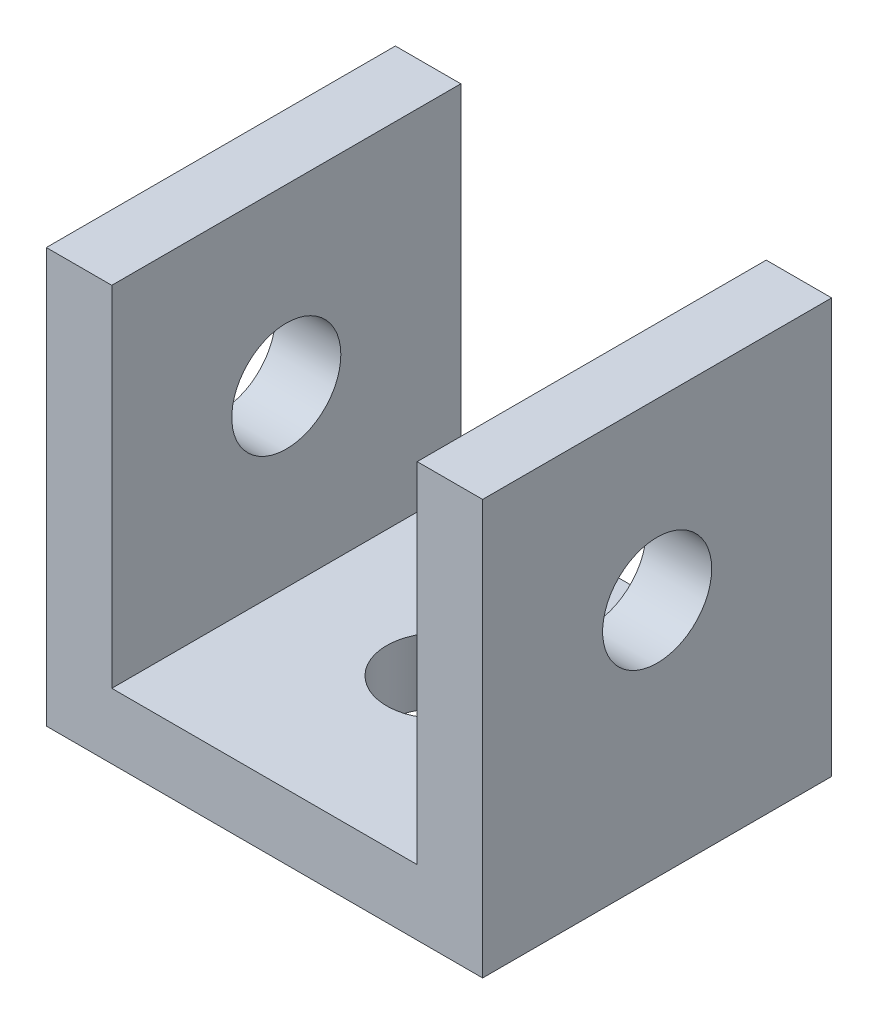
ISO-10303-21;
HEADER;
FILE_DESCRIPTION(('STEP AP214'),'2;1');
FILE_NAME('part.step','',(''),(''),'','','');
FILE_SCHEMA(('AUTOMOTIVE_DESIGN { 1 0 10303 214 1 1 1 1 }'));
ENDSEC;
DATA;
#1=APPLICATION_CONTEXT('core data for automotive mechanical design processes');
#2=APPLICATION_PROTOCOL_DEFINITION('international standard','automotive_design',2000,#1);
#3=PRODUCT_CONTEXT('',#1,'mechanical');
#4=PRODUCT('Part','Part','',(#3));
#5=PRODUCT_RELATED_PRODUCT_CATEGORY('part','',(#4));
#6=PRODUCT_DEFINITION_FORMATION('','',#4);
#7=PRODUCT_DEFINITION_CONTEXT('part definition',#1,'design');
#8=PRODUCT_DEFINITION('design','',#6,#7);
#9=PRODUCT_DEFINITION_SHAPE('','',#8);
#10=(LENGTH_UNIT() NAMED_UNIT(*) SI_UNIT(.MILLI.,.METRE.));
#11=(NAMED_UNIT(*) PLANE_ANGLE_UNIT() SI_UNIT($,.RADIAN.));
#12=(NAMED_UNIT(*) SI_UNIT($,.STERADIAN.) SOLID_ANGLE_UNIT());
#13=UNCERTAINTY_MEASURE_WITH_UNIT(LENGTH_MEASURE(1.E-05),#10,'distance_accuracy_value','');
#14=(GEOMETRIC_REPRESENTATION_CONTEXT(3) GLOBAL_UNCERTAINTY_ASSIGNED_CONTEXT((#13)) GLOBAL_UNIT_ASSIGNED_CONTEXT((#10,
#11,#12)) REPRESENTATION_CONTEXT('',''));
#15=CARTESIAN_POINT('',(0.,0.,0.));
#16=DIRECTION('',(0.,0.,1.));
#17=DIRECTION('',(1.,0.,0.));
#18=AXIS2_PLACEMENT_3D('',#15,#16,#17);
#19=CARTESIAN_POINT('',(0.,1.5,0.));
#20=DIRECTION('',(0.,-1.,0.));
#21=DIRECTION('',(0.,0.,-1.));
#22=AXIS2_PLACEMENT_3D('',#19,#20,#21);
#23=PLANE('',#22);
#24=CARTESIAN_POINT('',(0.,1.5,0.));
#25=DIRECTION('',(0.,-1.,0.));
#26=DIRECTION('',(0.,0.,-1.));
#27=AXIS2_PLACEMENT_3D('',#24,#25,#26);
#28=CIRCLE('',#27,1.2);
#29=CARTESIAN_POINT('',(0.,1.5,-1.2));
#30=VERTEX_POINT('',#29);
#31=EDGE_CURVE('E309',#30,#30,#28,.F.);
#32=ORIENTED_EDGE('',*,*,#31,.F.);
#33=EDGE_LOOP('',(#32));
#34=FACE_BOUND('',#33,.T.);
#35=DIRECTION('',(1.,0.,0.));
#36=VECTOR('',#35,1.);
#37=CARTESIAN_POINT('',(-5.,1.5,4.));
#38=LINE('',#37,#36);
#39=CARTESIAN_POINT('',(-3.5,1.5,4.));
#40=VERTEX_POINT('',#39);
#41=CARTESIAN_POINT('',(3.5,1.5,4.));
#42=VERTEX_POINT('',#41);
#43=EDGE_CURVE('E53',#40,#42,#38,.T.);
#44=ORIENTED_EDGE('',*,*,#43,.T.);
#45=DIRECTION('',(0.,0.,-1.));
#46=VECTOR('',#45,1.);
#47=CARTESIAN_POINT('',(3.5,1.5,-4.));
#48=LINE('',#47,#46);
#49=CARTESIAN_POINT('',(3.5,1.5,-4.));
#50=VERTEX_POINT('',#49);
#51=EDGE_CURVE('E48',#42,#50,#48,.T.);
#52=ORIENTED_EDGE('',*,*,#51,.T.);
#53=DIRECTION('',(-1.,0.,0.));
#54=VECTOR('',#53,1.);
#55=CARTESIAN_POINT('',(-5.,1.5,-4.));
#56=LINE('',#55,#54);
#57=CARTESIAN_POINT('',(-3.5,1.5,-4.));
#58=VERTEX_POINT('',#57);
#59=EDGE_CURVE('E153',#50,#58,#56,.T.);
#60=ORIENTED_EDGE('',*,*,#59,.T.);
#61=DIRECTION('',(0.,0.,-1.));
#62=VECTOR('',#61,1.);
#63=CARTESIAN_POINT('',(-3.5,1.5,-4.));
#64=LINE('',#63,#62);
#65=EDGE_CURVE('E132',#40,#58,#64,.T.);
#66=ORIENTED_EDGE('',*,*,#65,.F.);
#67=EDGE_LOOP('',(#44,#52,#60,#66));
#68=FACE_BOUND('',#67,.T.);
#69=ADVANCED_FACE('F33',(#34,#68),#23,.F.);
#70=CARTESIAN_POINT('',(5.,1.5,4.));
#71=DIRECTION('',(-1.,0.,0.));
#72=DIRECTION('',(0.,0.,1.));
#73=AXIS2_PLACEMENT_3D('',#70,#71,#72);
#74=PLANE('',#73);
#75=CARTESIAN_POINT('',(5.,5.5,0.));
#76=DIRECTION('',(1.,0.,0.));
#77=DIRECTION('',(0.,0.,-1.));
#78=AXIS2_PLACEMENT_3D('',#75,#76,#77);
#79=CIRCLE('',#78,1.25);
#80=CARTESIAN_POINT('',(5.,5.5,-1.25));
#81=VERTEX_POINT('',#80);
#82=EDGE_CURVE('E125',#81,#81,#79,.T.);
#83=ORIENTED_EDGE('',*,*,#82,.F.);
#84=EDGE_LOOP('',(#83));
#85=FACE_BOUND('',#84,.T.);
#86=DIRECTION('',(0.,0.,-1.));
#87=VECTOR('',#86,1.);
#88=CARTESIAN_POINT('',(5.,0.,4.));
#89=LINE('',#88,#87);
#90=CARTESIAN_POINT('',(5.,0.,4.));
#91=VERTEX_POINT('',#90);
#92=CARTESIAN_POINT('',(5.,0.,-4.));
#93=VERTEX_POINT('',#92);
#94=EDGE_CURVE('E102',#91,#93,#89,.T.);
#95=ORIENTED_EDGE('',*,*,#94,.T.);
#96=DIRECTION('',(0.,-1.,0.));
#97=VECTOR('',#96,1.);
#98=CARTESIAN_POINT('',(5.,1.5,-4.));
#99=LINE('',#98,#97);
#100=CARTESIAN_POINT('',(5.,9.5,-4.));
#101=VERTEX_POINT('',#100);
#102=EDGE_CURVE('E11',#101,#93,#99,.T.);
#103=ORIENTED_EDGE('',*,*,#102,.F.);
#104=DIRECTION('',(0.,0.,1.));
#105=VECTOR('',#104,1.);
#106=CARTESIAN_POINT('',(5.,9.5,-4.));
#107=LINE('',#106,#105);
#108=CARTESIAN_POINT('',(5.,9.5,4.));
#109=VERTEX_POINT('',#108);
#110=EDGE_CURVE('E99',#101,#109,#107,.T.);
#111=ORIENTED_EDGE('',*,*,#110,.T.);
#112=DIRECTION('',(0.,-1.,0.));
#113=VECTOR('',#112,1.);
#114=CARTESIAN_POINT('',(5.,1.5,4.));
#115=LINE('',#114,#113);
#116=EDGE_CURVE('E157',#109,#91,#115,.T.);
#117=ORIENTED_EDGE('',*,*,#116,.T.);
#118=EDGE_LOOP('',(#95,#103,#111,#117));
#119=FACE_BOUND('',#118,.T.);
#120=ADVANCED_FACE('F35',(#85,#119),#74,.F.);
#121=CARTESIAN_POINT('',(-5.,1.5,-4.));
#122=DIRECTION('',(0.,0.,1.));
#123=DIRECTION('',(1.,0.,0.));
#124=AXIS2_PLACEMENT_3D('',#121,#122,#123);
#125=PLANE('',#124);
#126=DIRECTION('',(-1.,0.,0.));
#127=VECTOR('',#126,1.);
#128=CARTESIAN_POINT('',(-5.,0.,-4.));
#129=LINE('',#128,#127);
#130=CARTESIAN_POINT('',(-5.,0.,-4.));
#131=VERTEX_POINT('',#130);
#132=EDGE_CURVE('E159',#93,#131,#129,.T.);
#133=ORIENTED_EDGE('',*,*,#132,.T.);
#134=DIRECTION('',(0.,-1.,0.));
#135=VECTOR('',#134,1.);
#136=CARTESIAN_POINT('',(-5.,1.5,-4.));
#137=LINE('',#136,#135);
#138=CARTESIAN_POINT('',(-5.,9.5,-4.));
#139=VERTEX_POINT('',#138);
#140=EDGE_CURVE('E41',#139,#131,#137,.T.);
#141=ORIENTED_EDGE('',*,*,#140,.F.);
#142=DIRECTION('',(-1.,0.,0.));
#143=VECTOR('',#142,1.);
#144=CARTESIAN_POINT('',(-5.,9.5,-4.));
#145=LINE('',#144,#143);
#146=CARTESIAN_POINT('',(-3.5,9.5,-4.));
#147=VERTEX_POINT('',#146);
#148=EDGE_CURVE('E142',#147,#139,#145,.T.);
#149=ORIENTED_EDGE('',*,*,#148,.F.);
#150=DIRECTION('',(0.,-1.,0.));
#151=VECTOR('',#150,1.);
#152=CARTESIAN_POINT('',(-3.5,9.5,-4.));
#153=LINE('',#152,#151);
#154=EDGE_CURVE('E145',#147,#58,#153,.T.);
#155=ORIENTED_EDGE('',*,*,#154,.T.);
#156=ORIENTED_EDGE('',*,*,#59,.F.);
#157=DIRECTION('',(0.,-1.,0.));
#158=VECTOR('',#157,1.);
#159=CARTESIAN_POINT('',(3.5,9.5,-4.));
#160=LINE('',#159,#158);
#161=CARTESIAN_POINT('',(3.5,9.5,-4.));
#162=VERTEX_POINT('',#161);
#163=EDGE_CURVE('E116',#162,#50,#160,.T.);
#164=ORIENTED_EDGE('',*,*,#163,.F.);
#165=DIRECTION('',(1.,0.,0.));
#166=VECTOR('',#165,1.);
#167=CARTESIAN_POINT('',(5.,9.5,-4.));
#168=LINE('',#167,#166);
#169=EDGE_CURVE('E109',#162,#101,#168,.T.);
#170=ORIENTED_EDGE('',*,*,#169,.T.);
#171=ORIENTED_EDGE('',*,*,#102,.T.);
#172=EDGE_LOOP('',(#133,#141,#149,#155,#156,#164,#170,#171));
#173=FACE_BOUND('',#172,.T.);
#174=ADVANCED_FACE('F114',(#173),#125,.F.);
#175=CARTESIAN_POINT('',(-5.,1.5,4.));
#176=DIRECTION('',(1.,0.,0.));
#177=DIRECTION('',(0.,0.,-1.));
#178=AXIS2_PLACEMENT_3D('',#175,#176,#177);
#179=PLANE('',#178);
#180=CARTESIAN_POINT('',(-5.,5.5,0.));
#181=DIRECTION('',(1.,0.,0.));
#182=DIRECTION('',(0.,0.,-1.));
#183=AXIS2_PLACEMENT_3D('',#180,#181,#182);
#184=CIRCLE('',#183,1.25);
#185=CARTESIAN_POINT('',(-5.,5.5,-1.25));
#186=VERTEX_POINT('',#185);
#187=EDGE_CURVE('E129',#186,#186,#184,.T.);
#188=ORIENTED_EDGE('',*,*,#187,.T.);
#189=EDGE_LOOP('',(#188));
#190=FACE_BOUND('',#189,.T.);
#191=DIRECTION('',(0.,0.,1.));
#192=VECTOR('',#191,1.);
#193=CARTESIAN_POINT('',(-5.,0.,4.));
#194=LINE('',#193,#192);
#195=CARTESIAN_POINT('',(-5.,0.,4.));
#196=VERTEX_POINT('',#195);
#197=EDGE_CURVE('E161',#131,#196,#194,.T.);
#198=ORIENTED_EDGE('',*,*,#197,.T.);
#199=DIRECTION('',(0.,-1.,0.));
#200=VECTOR('',#199,1.);
#201=CARTESIAN_POINT('',(-5.,1.5,4.));
#202=LINE('',#201,#200);
#203=CARTESIAN_POINT('',(-5.,9.5,4.));
#204=VERTEX_POINT('',#203);
#205=EDGE_CURVE('E165',#204,#196,#202,.T.);
#206=ORIENTED_EDGE('',*,*,#205,.F.);
#207=DIRECTION('',(0.,0.,1.));
#208=VECTOR('',#207,1.);
#209=CARTESIAN_POINT('',(-5.,9.5,-4.));
#210=LINE('',#209,#208);
#211=EDGE_CURVE('E135',#139,#204,#210,.T.);
#212=ORIENTED_EDGE('',*,*,#211,.F.);
#213=ORIENTED_EDGE('',*,*,#140,.T.);
#214=EDGE_LOOP('',(#198,#206,#212,#213));
#215=FACE_BOUND('',#214,.T.);
#216=ADVANCED_FACE('F171',(#190,#215),#179,.F.);
#217=CARTESIAN_POINT('',(-5.,1.5,4.));
#218=DIRECTION('',(0.,0.,-1.));
#219=DIRECTION('',(-1.,0.,0.));
#220=AXIS2_PLACEMENT_3D('',#217,#218,#219);
#221=PLANE('',#220);
#222=DIRECTION('',(1.,0.,0.));
#223=VECTOR('',#222,1.);
#224=CARTESIAN_POINT('',(-5.,0.,4.));
#225=LINE('',#224,#223);
#226=EDGE_CURVE('E155',#196,#91,#225,.T.);
#227=ORIENTED_EDGE('',*,*,#226,.T.);
#228=ORIENTED_EDGE('',*,*,#116,.F.);
#229=DIRECTION('',(-1.,0.,0.));
#230=VECTOR('',#229,1.);
#231=CARTESIAN_POINT('',(5.,9.5,4.));
#232=LINE('',#231,#230);
#233=CARTESIAN_POINT('',(3.5,9.5,4.));
#234=VERTEX_POINT('',#233);
#235=EDGE_CURVE('E112',#109,#234,#232,.T.);
#236=ORIENTED_EDGE('',*,*,#235,.T.);
#237=DIRECTION('',(0.,-1.,0.));
#238=VECTOR('',#237,1.);
#239=CARTESIAN_POINT('',(3.5,9.5,4.));
#240=LINE('',#239,#238);
#241=EDGE_CURVE('E123',#234,#42,#240,.T.);
#242=ORIENTED_EDGE('',*,*,#241,.T.);
#243=ORIENTED_EDGE('',*,*,#43,.F.);
#244=DIRECTION('',(0.,-1.,0.));
#245=VECTOR('',#244,1.);
#246=CARTESIAN_POINT('',(-3.5,9.5,4.));
#247=LINE('',#246,#245);
#248=CARTESIAN_POINT('',(-3.5,9.5,4.));
#249=VERTEX_POINT('',#248);
#250=EDGE_CURVE('E150',#249,#40,#247,.T.);
#251=ORIENTED_EDGE('',*,*,#250,.F.);
#252=DIRECTION('',(1.,0.,0.));
#253=VECTOR('',#252,1.);
#254=CARTESIAN_POINT('',(-5.,9.5,4.));
#255=LINE('',#254,#253);
#256=EDGE_CURVE('E138',#204,#249,#255,.T.);
#257=ORIENTED_EDGE('',*,*,#256,.F.);
#258=ORIENTED_EDGE('',*,*,#205,.T.);
#259=EDGE_LOOP('',(#227,#228,#236,#242,#243,#251,#257,#258));
#260=FACE_BOUND('',#259,.T.);
#261=ADVANCED_FACE('F177',(#260),#221,.F.);
#262=CARTESIAN_POINT('',(0.,0.,0.));
#263=DIRECTION('',(0.,-1.,0.));
#264=DIRECTION('',(0.,0.,-1.));
#265=AXIS2_PLACEMENT_3D('',#262,#263,#264);
#266=PLANE('',#265);
#267=CARTESIAN_POINT('',(0.,0.,0.));
#268=DIRECTION('',(0.,1.,0.));
#269=DIRECTION('',(0.,0.,1.));
#270=AXIS2_PLACEMENT_3D('',#267,#268,#269);
#271=CIRCLE('',#270,1.2);
#272=CARTESIAN_POINT('',(0.,0.,1.2));
#273=VERTEX_POINT('',#272);
#274=EDGE_CURVE('E307',#273,#273,#271,.T.);
#275=ORIENTED_EDGE('',*,*,#274,.T.);
#276=EDGE_LOOP('',(#275));
#277=FACE_BOUND('',#276,.T.);
#278=ORIENTED_EDGE('',*,*,#94,.F.);
#279=ORIENTED_EDGE('',*,*,#226,.F.);
#280=ORIENTED_EDGE('',*,*,#197,.F.);
#281=ORIENTED_EDGE('',*,*,#132,.F.);
#282=EDGE_LOOP('',(#278,#279,#280,#281));
#283=FACE_BOUND('',#282,.T.);
#284=ADVANCED_FACE('F175',(#277,#283),#266,.T.);
#285=CARTESIAN_POINT('',(-3.5,9.5,-4.));
#286=DIRECTION('',(-1.,0.,0.));
#287=DIRECTION('',(0.,0.,1.));
#288=AXIS2_PLACEMENT_3D('',#285,#286,#287);
#289=PLANE('',#288);
#290=CARTESIAN_POINT('',(-3.5,5.5,0.));
#291=DIRECTION('',(1.,0.,0.));
#292=DIRECTION('',(0.,0.,-1.));
#293=AXIS2_PLACEMENT_3D('',#290,#291,#292);
#294=CIRCLE('',#293,1.25);
#295=CARTESIAN_POINT('',(-3.5,5.5,-1.25));
#296=VERTEX_POINT('',#295);
#297=EDGE_CURVE('E128',#296,#296,#294,.T.);
#298=ORIENTED_EDGE('',*,*,#297,.F.);
#299=EDGE_LOOP('',(#298));
#300=FACE_BOUND('',#299,.T.);
#301=ORIENTED_EDGE('',*,*,#65,.T.);
#302=ORIENTED_EDGE('',*,*,#154,.F.);
#303=DIRECTION('',(0.,0.,-1.));
#304=VECTOR('',#303,1.);
#305=CARTESIAN_POINT('',(-3.5,9.5,-4.));
#306=LINE('',#305,#304);
#307=EDGE_CURVE('E140',#249,#147,#306,.T.);
#308=ORIENTED_EDGE('',*,*,#307,.F.);
#309=ORIENTED_EDGE('',*,*,#250,.T.);
#310=EDGE_LOOP('',(#301,#302,#308,#309));
#311=FACE_BOUND('',#310,.T.);
#312=ADVANCED_FACE('F185',(#300,#311),#289,.F.);
#313=CARTESIAN_POINT('',(0.,9.5,0.));
#314=DIRECTION('',(0.,1.,0.));
#315=DIRECTION('',(0.,0.,1.));
#316=AXIS2_PLACEMENT_3D('',#313,#314,#315);
#317=PLANE('',#316);
#318=ORIENTED_EDGE('',*,*,#211,.T.);
#319=ORIENTED_EDGE('',*,*,#256,.T.);
#320=ORIENTED_EDGE('',*,*,#307,.T.);
#321=ORIENTED_EDGE('',*,*,#148,.T.);
#322=EDGE_LOOP('',(#318,#319,#320,#321));
#323=FACE_BOUND('',#322,.T.);
#324=ADVANCED_FACE('F182',(#323),#317,.T.);
#325=CARTESIAN_POINT('',(-5.,5.5,0.));
#326=DIRECTION('',(1.,0.,0.));
#327=DIRECTION('',(0.,0.,-1.));
#328=AXIS2_PLACEMENT_3D('',#325,#326,#327);
#329=CYLINDRICAL_SURFACE('',#328,1.25);
#330=ORIENTED_EDGE('',*,*,#187,.F.);
#331=EDGE_LOOP('',(#330));
#332=FACE_BOUND('',#331,.T.);
#333=ORIENTED_EDGE('',*,*,#297,.T.);
#334=EDGE_LOOP('',(#333));
#335=FACE_BOUND('',#334,.T.);
#336=ADVANCED_FACE('F189',(#332,#335),#329,.F.);
#337=CARTESIAN_POINT('',(3.5,9.5,-4.));
#338=DIRECTION('',(-1.,0.,0.));
#339=DIRECTION('',(0.,0.,1.));
#340=AXIS2_PLACEMENT_3D('',#337,#338,#339);
#341=PLANE('',#340);
#342=CARTESIAN_POINT('',(3.5,5.5,0.));
#343=DIRECTION('',(1.,0.,0.));
#344=DIRECTION('',(0.,0.,-1.));
#345=AXIS2_PLACEMENT_3D('',#342,#343,#344);
#346=CIRCLE('',#345,1.25);
#347=CARTESIAN_POINT('',(3.5,5.5,-1.25));
#348=VERTEX_POINT('',#347);
#349=EDGE_CURVE('E310',#348,#348,#346,.T.);
#350=ORIENTED_EDGE('',*,*,#349,.T.);
#351=EDGE_LOOP('',(#350));
#352=FACE_BOUND('',#351,.T.);
#353=ORIENTED_EDGE('',*,*,#51,.F.);
#354=ORIENTED_EDGE('',*,*,#241,.F.);
#355=DIRECTION('',(0.,0.,-1.));
#356=VECTOR('',#355,1.);
#357=CARTESIAN_POINT('',(3.5,9.5,-4.));
#358=LINE('',#357,#356);
#359=EDGE_CURVE('E117',#234,#162,#358,.T.);
#360=ORIENTED_EDGE('',*,*,#359,.T.);
#361=ORIENTED_EDGE('',*,*,#163,.T.);
#362=EDGE_LOOP('',(#353,#354,#360,#361));
#363=FACE_BOUND('',#362,.T.);
#364=ADVANCED_FACE('F187',(#352,#363),#341,.T.);
#365=CARTESIAN_POINT('',(0.,9.5,0.));
#366=DIRECTION('',(0.,1.,0.));
#367=DIRECTION('',(0.,0.,1.));
#368=AXIS2_PLACEMENT_3D('',#365,#366,#367);
#369=PLANE('',#368);
#370=ORIENTED_EDGE('',*,*,#110,.F.);
#371=ORIENTED_EDGE('',*,*,#169,.F.);
#372=ORIENTED_EDGE('',*,*,#359,.F.);
#373=ORIENTED_EDGE('',*,*,#235,.F.);
#374=EDGE_LOOP('',(#370,#371,#372,#373));
#375=FACE_BOUND('',#374,.T.);
#376=ADVANCED_FACE('F107',(#375),#369,.T.);
#377=CARTESIAN_POINT('',(5.,5.5,0.));
#378=DIRECTION('',(-1.,0.,0.));
#379=DIRECTION('',(0.,0.,1.));
#380=AXIS2_PLACEMENT_3D('',#377,#378,#379);
#381=CYLINDRICAL_SURFACE('',#380,1.25);
#382=ORIENTED_EDGE('',*,*,#82,.T.);
#383=EDGE_LOOP('',(#382));
#384=FACE_BOUND('',#383,.T.);
#385=ORIENTED_EDGE('',*,*,#349,.F.);
#386=EDGE_LOOP('',(#385));
#387=FACE_BOUND('',#386,.T.);
#388=ADVANCED_FACE('F196',(#384,#387),#381,.F.);
#389=CARTESIAN_POINT('',(0.,9.5,0.));
#390=DIRECTION('',(0.,-1.,0.));
#391=DIRECTION('',(0.,0.,-1.));
#392=AXIS2_PLACEMENT_3D('',#389,#390,#391);
#393=CYLINDRICAL_SURFACE('',#392,1.2);
#394=ORIENTED_EDGE('',*,*,#274,.F.);
#395=EDGE_LOOP('',(#394));
#396=FACE_BOUND('',#395,.T.);
#397=ORIENTED_EDGE('',*,*,#31,.T.);
#398=EDGE_LOOP('',(#397));
#399=FACE_BOUND('',#398,.T.);
#400=ADVANCED_FACE('F291',(#396,#399),#393,.F.);
#401=CLOSED_SHELL('',(#69,#120,#174,#216,#261,#284,#312,#324,#336,#364,#376,#388,#400));
#402=MANIFOLD_SOLID_BREP('B2',#401);
#403=ADVANCED_BREP_SHAPE_REPRESENTATION('',(#18,#402),#14);
#404=SHAPE_DEFINITION_REPRESENTATION(#9,#403);
ENDSEC;
END-ISO-10303-21;
